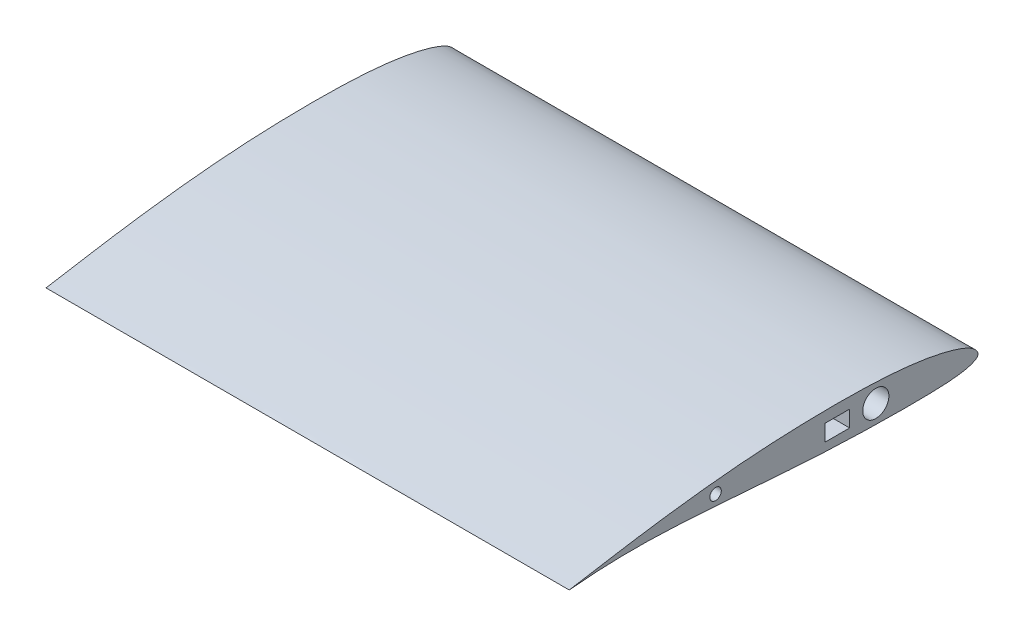
ISO-10303-21;
HEADER;
FILE_DESCRIPTION(('STEP AP214'),'2;1');
FILE_NAME('part.step','',(''),(''),'','','');
FILE_SCHEMA(('AUTOMOTIVE_DESIGN { 1 0 10303 214 1 1 1 1 }'));
ENDSEC;
DATA;
#1=APPLICATION_CONTEXT('core data for automotive mechanical design processes');
#2=APPLICATION_PROTOCOL_DEFINITION('international standard','automotive_design',2000,#1);
#3=PRODUCT_CONTEXT('',#1,'mechanical');
#4=PRODUCT('Part','Part','',(#3));
#5=PRODUCT_RELATED_PRODUCT_CATEGORY('part','',(#4));
#6=PRODUCT_DEFINITION_FORMATION('','',#4);
#7=PRODUCT_DEFINITION_CONTEXT('part definition',#1,'design');
#8=PRODUCT_DEFINITION('design','',#6,#7);
#9=PRODUCT_DEFINITION_SHAPE('','',#8);
#10=(LENGTH_UNIT() NAMED_UNIT(*) SI_UNIT(.MILLI.,.METRE.));
#11=(NAMED_UNIT(*) PLANE_ANGLE_UNIT() SI_UNIT($,.RADIAN.));
#12=(NAMED_UNIT(*) SI_UNIT($,.STERADIAN.) SOLID_ANGLE_UNIT());
#13=UNCERTAINTY_MEASURE_WITH_UNIT(LENGTH_MEASURE(1.E-05),#10,'distance_accuracy_value','');
#14=(GEOMETRIC_REPRESENTATION_CONTEXT(3) GLOBAL_UNCERTAINTY_ASSIGNED_CONTEXT((#13)) GLOBAL_UNIT_ASSIGNED_CONTEXT((#10,
#11,#12)) REPRESENTATION_CONTEXT('',''));
#15=CARTESIAN_POINT('',(0.,0.,0.));
#16=DIRECTION('',(0.,0.,1.));
#17=DIRECTION('',(1.,0.,0.));
#18=AXIS2_PLACEMENT_3D('',#15,#16,#17);
#19=CARTESIAN_POINT('',(320.,1.49711132773622,0.435092083404368));
#20=DIRECTION('',(-1.,0.,0.));
#21=DIRECTION('',(0.,0.,1.));
#22=AXIS2_PLACEMENT_3D('',#19,#20,#21);
#23=PLANE('',#22);
#24=CARTESIAN_POINT('',(320.,6.07732270373844,160.499919709394));
#25=DIRECTION('',(1.,0.,0.));
#26=DIRECTION('',(0.,0.,-1.));
#27=AXIS2_PLACEMENT_3D('',#24,#25,#26);
#28=CIRCLE('',#27,3.50000000000002);
#29=CARTESIAN_POINT('',(320.,6.07732270373844,156.999919709394));
#30=VERTEX_POINT('',#29);
#31=EDGE_CURVE('E148',#30,#30,#28,.T.);
#32=ORIENTED_EDGE('',*,*,#31,.F.);
#33=EDGE_LOOP('',(#32));
#34=FACE_BOUND('',#33,.T.);
#35=CARTESIAN_POINT('',(320.,5.07732270373844,62.4999197093942));
#36=DIRECTION('',(1.,0.,0.));
#37=DIRECTION('',(0.,0.,-1.));
#38=AXIS2_PLACEMENT_3D('',#35,#36,#37);
#39=CIRCLE('',#38,8.);
#40=CARTESIAN_POINT('',(320.,5.07732270373844,54.4999197093942));
#41=VERTEX_POINT('',#40);
#42=EDGE_CURVE('E113',#41,#41,#39,.T.);
#43=ORIENTED_EDGE('',*,*,#42,.F.);
#44=EDGE_LOOP('',(#43));
#45=FACE_BOUND('',#44,.T.);
#46=CARTESIAN_POINT('',(320.,0.,250.));
#47=CARTESIAN_POINT('',(320.,-0.0080427959719715,250.000228293678));
#48=CARTESIAN_POINT('',(320.,0.172375657967406,248.284955515532));
#49=CARTESIAN_POINT('',(320.,0.308690014795419,246.518112419387));
#50=CARTESIAN_POINT('',(320.,0.685693593852336,242.189387343398));
#51=CARTESIAN_POINT('',(320.,1.07410152891603,236.806461263496));
#52=CARTESIAN_POINT('',(320.,1.49731723995003,229.680385951639));
#53=CARTESIAN_POINT('',(320.,1.8232186026768,221.18415869828));
#54=CARTESIAN_POINT('',(320.,1.96762610068065,211.337618207726));
#55=CARTESIAN_POINT('',(320.,1.83322105638369,200.371188527109));
#56=CARTESIAN_POINT('',(320.,1.38960528984164,188.499913622482));
#57=CARTESIAN_POINT('',(320.,0.706014078000893,175.953687417433));
#58=CARTESIAN_POINT('',(320.,-0.160208641561513,162.931424917666));
#59=CARTESIAN_POINT('',(320.,-1.14801632724376,149.615771743617));
#60=CARTESIAN_POINT('',(320.,-2.19092490983926,136.176354994724));
#61=CARTESIAN_POINT('',(320.,-3.21958397917046,122.767140548026));
#62=CARTESIAN_POINT('',(320.,-4.15274312671142,109.520053587455));
#63=CARTESIAN_POINT('',(320.,-4.93856436487493,96.5460959745437));
#64=CARTESIAN_POINT('',(320.,-5.53683070268675,83.9408193016427));
#65=CARTESIAN_POINT('',(320.,-5.94764820461108,71.8018392906514));
#66=CARTESIAN_POINT('',(320.,-6.21845093878312,60.2452560030716));
#67=CARTESIAN_POINT('',(320.,-6.35536975583973,49.3987328907547));
#68=CARTESIAN_POINT('',(320.,-6.38138796281789,39.3972261942655));
#69=CARTESIAN_POINT('',(320.,-6.26504923032313,30.3619348419668));
#70=CARTESIAN_POINT('',(320.,-6.01216491688521,22.4121811031587));
#71=CARTESIAN_POINT('',(320.,-5.59743390072595,15.6262272306516));
#72=CARTESIAN_POINT('',(320.,-4.92870657935606,10.0719075109048));
#73=CARTESIAN_POINT('',(320.,-4.04044698146404,5.69769261214423));
#74=CARTESIAN_POINT('',(320.,-2.8657529844069,2.62532063874475));
#75=CARTESIAN_POINT('',(320.,-1.7115284699546,0.494884225045661));
#76=CARTESIAN_POINT('',(320.,-0.410454230626488,-0.0213125491030087));
#77=CARTESIAN_POINT('',(320.,0.792659826704065,0.0311691995850224));
#78=CARTESIAN_POINT('',(320.,2.30568433693192,0.812599241892923));
#79=CARTESIAN_POINT('',(320.,4.23835242447377,2.72886351673443));
#80=CARTESIAN_POINT('',(320.,6.11817212106947,5.76990724125498));
#81=CARTESIAN_POINT('',(320.,7.91359420170391,9.88094280419771));
#82=CARTESIAN_POINT('',(320.,9.64131817838287,15.0749304677094));
#83=CARTESIAN_POINT('',(320.,11.2838964878058,21.2987522216172));
#84=CARTESIAN_POINT('',(320.,12.7883817585812,28.4971721202648));
#85=CARTESIAN_POINT('',(320.,14.0978349081275,36.6073734062479));
#86=CARTESIAN_POINT('',(320.,15.1594290171638,45.573028440303));
#87=CARTESIAN_POINT('',(320.,15.9609039979753,55.3329100744701));
#88=CARTESIAN_POINT('',(320.,16.4940697383882,65.8165364983871));
#89=CARTESIAN_POINT('',(320.,16.7919897051422,76.9313762604552));
#90=CARTESIAN_POINT('',(320.,16.864754130909,88.5669490281142));
#91=CARTESIAN_POINT('',(320.,16.7267152914356,100.596999885542));
#92=CARTESIAN_POINT('',(320.,16.3833850637257,112.888825982424));
#93=CARTESIAN_POINT('',(320.,15.825573666627,125.31161581915));
#94=CARTESIAN_POINT('',(320.,15.0523318700684,137.743791097076));
#95=CARTESIAN_POINT('',(320.,14.0593390742259,150.072384382085));
#96=CARTESIAN_POINT('',(320.,12.8815869860292,162.191375055682));
#97=CARTESIAN_POINT('',(320.,11.5492803460744,173.989074322246));
#98=CARTESIAN_POINT('',(320.,10.1162497290333,185.35236444642));
#99=CARTESIAN_POINT('',(320.,8.63237912523508,196.163081697706));
#100=CARTESIAN_POINT('',(320.,7.13151388385034,206.300441402258));
#101=CARTESIAN_POINT('',(320.,5.73122176805054,215.560350587015));
#102=CARTESIAN_POINT('',(320.,4.29329512716244,223.97715704258));
#103=CARTESIAN_POINT('',(320.,3.1818088737293,231.363413336396));
#104=CARTESIAN_POINT('',(320.,2.09894241729889,237.746440904332));
#105=CARTESIAN_POINT('',(320.,1.2458619166603,242.622069365861));
#106=CARTESIAN_POINT('',(320.,0.552864946230777,246.64452933247));
#107=CARTESIAN_POINT('',(320.,0.246216764640028,248.328398440367));
#108=CARTESIAN_POINT('',(320.,0.00797737724443801,249.999773563223));
#109=CARTESIAN_POINT('',(320.,0.,250.));
#110=B_SPLINE_CURVE_WITH_KNOTS('',3,(#46,#47,#48,#49,#50,#51,#52,#53,#54,#55,#56,#57,#58,#59,
#60,#61,#62,#63,#64,#65,#66,#67,#68,#69,#70,#71,#72,#73,#74,#75,#76,#77,#78,#79,#80,#81,#82,#83,
#84,#85,#86,#87,#88,#89,#90,#91,#92,#93,#94,#95,#96,#97,#98,#99,#100,#101,#102,#103,#104,#105,
#106,#107,#108,#109),.UNSPECIFIED.,.T.,.F.,(4,1,1,1,1,1,1,1,1,1,1,1,1,1,1,1,1,1,1,1,1,1,1,1,1,1,
1,1,1,1,1,1,1,1,1,1,1,1,1,1,1,1,1,1,1,1,1,1,1,1,1,1,1,1,1,1,1,1,1,1,1,4),(0.,
0.00158888881614516,0.00632921783555629,0.0142024564897436,0.0251728077530557,
0.0391734833267743,0.0560606311759249,0.0755789238487882,0.0973636066296903,0.120926258366677,
0.145825281006277,0.171670911815127,0.198108536705041,0.22479018357162,0.25139057978404,
0.277643490654311,0.303326750051388,0.328257458029316,0.352272548115194,0.375156061746876,
0.396620664402003,0.416422729294005,0.434304420097656,0.450054679859308,0.463465465082325,
0.474478994238096,0.483169222153171,0.489678354497499,0.494104066315722,0.496910015324886,
0.497289784891853,0.501214273282496,0.506457950332762,0.51335695674223,0.522168631834455,
0.53296596992453,0.545689209241574,0.56022077890382,0.57643892310517,0.594258689005965,
0.613600244568652,0.634342385932902,0.656331109263004,0.679351893859712,0.703152302846811,
0.727478208080039,0.7520707394079,0.776691163534608,0.801140183976245,0.825214386971546,
0.848697423570622,0.871352857669295,0.892947448931157,0.913230871058069,0.931955467148994,
0.94834206907442,0.963693004275676,0.976235918239566,0.986320058750392,0.993788799349345,
0.998424034933867,1.),.UNSPECIFIED.);
#111=CARTESIAN_POINT('',(320.,0.,250.));
#112=VERTEX_POINT('',#111);
#113=EDGE_CURVE('E11',#112,#112,#110,.T.);
#114=ORIENTED_EDGE('',*,*,#113,.T.);
#115=EDGE_LOOP('',(#114));
#116=FACE_BOUND('',#115,.T.);
#117=DIRECTION('',(0.,1.,0.));
#118=VECTOR('',#117,1.);
#119=CARTESIAN_POINT('',(320.,10.0773227037384,78.4999197093942));
#120=LINE('',#119,#118);
#121=CARTESIAN_POINT('',(320.,0.0773227037384437,78.4999197093942));
#122=VERTEX_POINT('',#121);
#123=CARTESIAN_POINT('',(320.,10.0773227037384,78.4999197093942));
#124=VERTEX_POINT('',#123);
#125=EDGE_CURVE('E75',#122,#124,#120,.T.);
#126=ORIENTED_EDGE('',*,*,#125,.F.);
#127=DIRECTION('',(0.,0.,-1.));
#128=VECTOR('',#127,1.);
#129=CARTESIAN_POINT('',(320.,0.0773227037384437,78.4999197093942));
#130=LINE('',#129,#128);
#131=CARTESIAN_POINT('',(320.,0.0773227037384437,93.4999197093942));
#132=VERTEX_POINT('',#131);
#133=EDGE_CURVE('E97',#132,#122,#130,.T.);
#134=ORIENTED_EDGE('',*,*,#133,.F.);
#135=DIRECTION('',(0.,-1.,0.));
#136=VECTOR('',#135,1.);
#137=CARTESIAN_POINT('',(320.,10.0773227037384,93.4999197093942));
#138=LINE('',#137,#136);
#139=CARTESIAN_POINT('',(320.,10.0773227037384,93.4999197093942));
#140=VERTEX_POINT('',#139);
#141=EDGE_CURVE('E95',#140,#132,#138,.T.);
#142=ORIENTED_EDGE('',*,*,#141,.F.);
#143=DIRECTION('',(0.,0.,1.));
#144=VECTOR('',#143,1.);
#145=CARTESIAN_POINT('',(320.,10.0773227037384,78.4999197093942));
#146=LINE('',#145,#144);
#147=EDGE_CURVE('E83',#124,#140,#146,.T.);
#148=ORIENTED_EDGE('',*,*,#147,.F.);
#149=EDGE_LOOP('',(#126,#134,#142,#148));
#150=FACE_BOUND('',#149,.T.);
#151=ADVANCED_FACE('F32',(#34,#45,#116,#150),#23,.F.);
#152=CARTESIAN_POINT('',(0.,1.49711132773622,0.435092083404368));
#153=DIRECTION('',(-1.,0.,0.));
#154=DIRECTION('',(0.,0.,1.));
#155=AXIS2_PLACEMENT_3D('',#152,#153,#154);
#156=PLANE('',#155);
#157=CARTESIAN_POINT('',(0.,6.07732270373844,160.499919709394));
#158=DIRECTION('',(-1.,0.,0.));
#159=DIRECTION('',(0.,0.,1.));
#160=AXIS2_PLACEMENT_3D('',#157,#158,#159);
#161=CIRCLE('',#160,3.49999999999999);
#162=CARTESIAN_POINT('',(0.,6.07732270373844,163.999919709394));
#163=VERTEX_POINT('',#162);
#164=EDGE_CURVE('E160',#163,#163,#161,.T.);
#165=ORIENTED_EDGE('',*,*,#164,.F.);
#166=EDGE_LOOP('',(#165));
#167=FACE_BOUND('',#166,.T.);
#168=CARTESIAN_POINT('',(0.,0.,250.));
#169=CARTESIAN_POINT('',(0.,-0.0080427959719715,250.000228293678));
#170=CARTESIAN_POINT('',(0.,0.172375657967406,248.284955515532));
#171=CARTESIAN_POINT('',(0.,0.308690014795419,246.518112419387));
#172=CARTESIAN_POINT('',(0.,0.685693593852336,242.189387343398));
#173=CARTESIAN_POINT('',(0.,1.07410152891603,236.806461263496));
#174=CARTESIAN_POINT('',(0.,1.49731723995003,229.680385951639));
#175=CARTESIAN_POINT('',(0.,1.8232186026768,221.18415869828));
#176=CARTESIAN_POINT('',(0.,1.96762610068065,211.337618207726));
#177=CARTESIAN_POINT('',(0.,1.83322105638369,200.371188527109));
#178=CARTESIAN_POINT('',(0.,1.38960528984164,188.499913622482));
#179=CARTESIAN_POINT('',(0.,0.706014078000893,175.953687417433));
#180=CARTESIAN_POINT('',(0.,-0.160208641561513,162.931424917666));
#181=CARTESIAN_POINT('',(0.,-1.14801632724376,149.615771743617));
#182=CARTESIAN_POINT('',(0.,-2.19092490983926,136.176354994724));
#183=CARTESIAN_POINT('',(0.,-3.21958397917046,122.767140548026));
#184=CARTESIAN_POINT('',(0.,-4.15274312671142,109.520053587455));
#185=CARTESIAN_POINT('',(0.,-4.93856436487493,96.5460959745437));
#186=CARTESIAN_POINT('',(0.,-5.53683070268675,83.9408193016427));
#187=CARTESIAN_POINT('',(0.,-5.94764820461108,71.8018392906514));
#188=CARTESIAN_POINT('',(0.,-6.21845093878312,60.2452560030716));
#189=CARTESIAN_POINT('',(0.,-6.35536975583973,49.3987328907547));
#190=CARTESIAN_POINT('',(0.,-6.38138796281789,39.3972261942655));
#191=CARTESIAN_POINT('',(0.,-6.26504923032313,30.3619348419668));
#192=CARTESIAN_POINT('',(0.,-6.01216491688521,22.4121811031587));
#193=CARTESIAN_POINT('',(0.,-5.59743390072595,15.6262272306516));
#194=CARTESIAN_POINT('',(0.,-4.92870657935606,10.0719075109048));
#195=CARTESIAN_POINT('',(0.,-4.04044698146404,5.69769261214423));
#196=CARTESIAN_POINT('',(0.,-2.8657529844069,2.62532063874475));
#197=CARTESIAN_POINT('',(0.,-1.7115284699546,0.494884225045661));
#198=CARTESIAN_POINT('',(0.,-0.410454230626488,-0.0213125491030087));
#199=CARTESIAN_POINT('',(0.,0.792659826704065,0.0311691995850224));
#200=CARTESIAN_POINT('',(0.,2.30568433693192,0.812599241892923));
#201=CARTESIAN_POINT('',(0.,4.23835242447377,2.72886351673443));
#202=CARTESIAN_POINT('',(0.,6.11817212106947,5.76990724125498));
#203=CARTESIAN_POINT('',(0.,7.91359420170391,9.88094280419771));
#204=CARTESIAN_POINT('',(0.,9.64131817838287,15.0749304677094));
#205=CARTESIAN_POINT('',(0.,11.2838964878058,21.2987522216172));
#206=CARTESIAN_POINT('',(0.,12.7883817585812,28.4971721202648));
#207=CARTESIAN_POINT('',(0.,14.0978349081275,36.6073734062479));
#208=CARTESIAN_POINT('',(0.,15.1594290171638,45.573028440303));
#209=CARTESIAN_POINT('',(0.,15.9609039979753,55.3329100744701));
#210=CARTESIAN_POINT('',(0.,16.4940697383882,65.8165364983871));
#211=CARTESIAN_POINT('',(0.,16.7919897051422,76.9313762604552));
#212=CARTESIAN_POINT('',(0.,16.864754130909,88.5669490281142));
#213=CARTESIAN_POINT('',(0.,16.7267152914356,100.596999885542));
#214=CARTESIAN_POINT('',(0.,16.3833850637257,112.888825982424));
#215=CARTESIAN_POINT('',(0.,15.825573666627,125.31161581915));
#216=CARTESIAN_POINT('',(0.,15.0523318700684,137.743791097076));
#217=CARTESIAN_POINT('',(0.,14.0593390742259,150.072384382085));
#218=CARTESIAN_POINT('',(0.,12.8815869860292,162.191375055682));
#219=CARTESIAN_POINT('',(0.,11.5492803460744,173.989074322246));
#220=CARTESIAN_POINT('',(0.,10.1162497290333,185.35236444642));
#221=CARTESIAN_POINT('',(0.,8.63237912523508,196.163081697706));
#222=CARTESIAN_POINT('',(0.,7.13151388385034,206.300441402258));
#223=CARTESIAN_POINT('',(0.,5.73122176805054,215.560350587015));
#224=CARTESIAN_POINT('',(0.,4.29329512716244,223.97715704258));
#225=CARTESIAN_POINT('',(0.,3.1818088737293,231.363413336396));
#226=CARTESIAN_POINT('',(0.,2.09894241729889,237.746440904332));
#227=CARTESIAN_POINT('',(0.,1.2458619166603,242.622069365861));
#228=CARTESIAN_POINT('',(0.,0.552864946230777,246.64452933247));
#229=CARTESIAN_POINT('',(0.,0.246216764640028,248.328398440367));
#230=CARTESIAN_POINT('',(0.,0.00797737724443801,249.999773563223));
#231=CARTESIAN_POINT('',(0.,0.,250.));
#232=B_SPLINE_CURVE_WITH_KNOTS('',3,(#168,#169,#170,#171,#172,#173,#174,#175,#176,#177,#178,
#179,#180,#181,#182,#183,#184,#185,#186,#187,#188,#189,#190,#191,#192,#193,#194,#195,#196,#197,
#198,#199,#200,#201,#202,#203,#204,#205,#206,#207,#208,#209,#210,#211,#212,#213,#214,#215,#216,
#217,#218,#219,#220,#221,#222,#223,#224,#225,#226,#227,#228,#229,#230,#231),.UNSPECIFIED.,.T.,
.F.,(4,1,1,1,1,1,1,1,1,1,1,1,1,1,1,1,1,1,1,1,1,1,1,1,1,1,1,1,1,1,1,1,1,1,1,1,1,1,1,1,1,1,1,1,1,
1,1,1,1,1,1,1,1,1,1,1,1,1,1,1,1,4),(0.,0.00158888881614516,0.00632921783555629,
0.0142024564897436,0.0251728077530557,0.0391734833267743,0.0560606311759249,0.0755789238487882,
0.0973636066296903,0.120926258366677,0.145825281006277,0.171670911815127,0.198108536705041,
0.22479018357162,0.25139057978404,0.277643490654311,0.303326750051388,0.328257458029316,
0.352272548115194,0.375156061746876,0.396620664402003,0.416422729294005,0.434304420097656,
0.450054679859308,0.463465465082325,0.474478994238096,0.483169222153171,0.489678354497499,
0.494104066315722,0.496910015324886,0.497289784891853,0.501214273282496,0.506457950332762,
0.51335695674223,0.522168631834455,0.53296596992453,0.545689209241574,0.56022077890382,
0.57643892310517,0.594258689005965,0.613600244568652,0.634342385932902,0.656331109263004,
0.679351893859712,0.703152302846811,0.727478208080039,0.7520707394079,0.776691163534608,
0.801140183976245,0.825214386971546,0.848697423570622,0.871352857669295,0.892947448931157,
0.913230871058069,0.931955467148994,0.94834206907442,0.963693004275676,0.976235918239566,
0.986320058750392,0.993788799349345,0.998424034933867,1.),.UNSPECIFIED.);
#233=CARTESIAN_POINT('',(0.,0.,250.));
#234=VERTEX_POINT('',#233);
#235=EDGE_CURVE('E37',#234,#234,#232,.T.);
#236=ORIENTED_EDGE('',*,*,#235,.F.);
#237=EDGE_LOOP('',(#236));
#238=FACE_BOUND('',#237,.T.);
#239=CARTESIAN_POINT('',(0.,5.07732270373844,62.4999197093942));
#240=DIRECTION('',(1.,0.,0.));
#241=DIRECTION('',(0.,0.,-1.));
#242=AXIS2_PLACEMENT_3D('',#239,#240,#241);
#243=CIRCLE('',#242,8.);
#244=CARTESIAN_POINT('',(0.,5.07732270373844,54.4999197093942));
#245=VERTEX_POINT('',#244);
#246=EDGE_CURVE('E91',#245,#245,#243,.T.);
#247=ORIENTED_EDGE('',*,*,#246,.T.);
#248=EDGE_LOOP('',(#247));
#249=FACE_BOUND('',#248,.T.);
#250=DIRECTION('',(0.,0.,-1.));
#251=VECTOR('',#250,1.);
#252=CARTESIAN_POINT('',(0.,0.0773227037384437,78.4999197093942));
#253=LINE('',#252,#251);
#254=CARTESIAN_POINT('',(0.,0.0773227037384437,93.4999197093942));
#255=VERTEX_POINT('',#254);
#256=CARTESIAN_POINT('',(0.,0.0773227037384437,78.4999197093942));
#257=VERTEX_POINT('',#256);
#258=EDGE_CURVE('E84',#255,#257,#253,.T.);
#259=ORIENTED_EDGE('',*,*,#258,.T.);
#260=DIRECTION('',(0.,1.,0.));
#261=VECTOR('',#260,1.);
#262=CARTESIAN_POINT('',(0.,10.0773227037384,78.4999197093942));
#263=LINE('',#262,#261);
#264=CARTESIAN_POINT('',(0.,10.0773227037384,78.4999197093942));
#265=VERTEX_POINT('',#264);
#266=EDGE_CURVE('E57',#257,#265,#263,.T.);
#267=ORIENTED_EDGE('',*,*,#266,.T.);
#268=DIRECTION('',(0.,0.,1.));
#269=VECTOR('',#268,1.);
#270=CARTESIAN_POINT('',(0.,10.0773227037384,78.4999197093942));
#271=LINE('',#270,#269);
#272=CARTESIAN_POINT('',(0.,10.0773227037384,93.4999197093942));
#273=VERTEX_POINT('',#272);
#274=EDGE_CURVE('E90',#265,#273,#271,.T.);
#275=ORIENTED_EDGE('',*,*,#274,.T.);
#276=DIRECTION('',(0.,-1.,0.));
#277=VECTOR('',#276,1.);
#278=CARTESIAN_POINT('',(0.,10.0773227037384,93.4999197093942));
#279=LINE('',#278,#277);
#280=EDGE_CURVE('E105',#273,#255,#279,.T.);
#281=ORIENTED_EDGE('',*,*,#280,.T.);
#282=EDGE_LOOP('',(#259,#267,#275,#281));
#283=FACE_BOUND('',#282,.T.);
#284=ADVANCED_FACE('F125',(#167,#238,#249,#283),#156,.T.);
#285=DIRECTION('',(-1.,0.,0.));
#286=VECTOR('',#285,1.);
#287=SURFACE_OF_LINEAR_EXTRUSION('',#110,#286);
#288=ORIENTED_EDGE('',*,*,#113,.F.);
#289=EDGE_LOOP('',(#288));
#290=FACE_BOUND('',#289,.T.);
#291=ORIENTED_EDGE('',*,*,#235,.T.);
#292=EDGE_LOOP('',(#291));
#293=FACE_BOUND('',#292,.T.);
#294=ADVANCED_FACE('F34',(#290,#293),#287,.F.);
#295=CARTESIAN_POINT('',(320.,5.07732270373844,62.4999197093942));
#296=DIRECTION('',(-1.,0.,0.));
#297=DIRECTION('',(0.,0.,1.));
#298=AXIS2_PLACEMENT_3D('',#295,#296,#297);
#299=CYLINDRICAL_SURFACE('',#298,8.);
#300=ORIENTED_EDGE('',*,*,#42,.T.);
#301=EDGE_LOOP('',(#300));
#302=FACE_BOUND('',#301,.T.);
#303=ORIENTED_EDGE('',*,*,#246,.F.);
#304=EDGE_LOOP('',(#303));
#305=FACE_BOUND('',#304,.T.);
#306=ADVANCED_FACE('F128',(#302,#305),#299,.F.);
#307=CARTESIAN_POINT('',(320.,10.0773227037384,78.4999197093942));
#308=DIRECTION('',(0.,0.,1.));
#309=DIRECTION('',(1.,0.,0.));
#310=AXIS2_PLACEMENT_3D('',#307,#308,#309);
#311=PLANE('',#310);
#312=ORIENTED_EDGE('',*,*,#266,.F.);
#313=DIRECTION('',(-1.,0.,0.));
#314=VECTOR('',#313,1.);
#315=CARTESIAN_POINT('',(320.,0.0773227037384437,78.4999197093942));
#316=LINE('',#315,#314);
#317=EDGE_CURVE('E79',#122,#257,#316,.T.);
#318=ORIENTED_EDGE('',*,*,#317,.F.);
#319=ORIENTED_EDGE('',*,*,#125,.T.);
#320=DIRECTION('',(-1.,0.,0.));
#321=VECTOR('',#320,1.);
#322=CARTESIAN_POINT('',(320.,10.0773227037384,78.4999197093942));
#323=LINE('',#322,#321);
#324=EDGE_CURVE('E78',#124,#265,#323,.T.);
#325=ORIENTED_EDGE('',*,*,#324,.T.);
#326=EDGE_LOOP('',(#312,#318,#319,#325));
#327=FACE_BOUND('',#326,.T.);
#328=ADVANCED_FACE('F77',(#327),#311,.T.);
#329=CARTESIAN_POINT('',(320.,10.0773227037384,78.4999197093942));
#330=DIRECTION('',(0.,-1.,0.));
#331=DIRECTION('',(0.,0.,-1.));
#332=AXIS2_PLACEMENT_3D('',#329,#330,#331);
#333=PLANE('',#332);
#334=ORIENTED_EDGE('',*,*,#274,.F.);
#335=ORIENTED_EDGE('',*,*,#324,.F.);
#336=ORIENTED_EDGE('',*,*,#147,.T.);
#337=DIRECTION('',(-1.,0.,0.));
#338=VECTOR('',#337,1.);
#339=CARTESIAN_POINT('',(320.,10.0773227037384,93.4999197093942));
#340=LINE('',#339,#338);
#341=EDGE_CURVE('E92',#140,#273,#340,.T.);
#342=ORIENTED_EDGE('',*,*,#341,.T.);
#343=EDGE_LOOP('',(#334,#335,#336,#342));
#344=FACE_BOUND('',#343,.T.);
#345=ADVANCED_FACE('F87',(#344),#333,.T.);
#346=CARTESIAN_POINT('',(320.,10.0773227037384,93.4999197093942));
#347=DIRECTION('',(0.,0.,-1.));
#348=DIRECTION('',(-1.,0.,0.));
#349=AXIS2_PLACEMENT_3D('',#346,#347,#348);
#350=PLANE('',#349);
#351=ORIENTED_EDGE('',*,*,#280,.F.);
#352=ORIENTED_EDGE('',*,*,#341,.F.);
#353=ORIENTED_EDGE('',*,*,#141,.T.);
#354=DIRECTION('',(-1.,0.,0.));
#355=VECTOR('',#354,1.);
#356=CARTESIAN_POINT('',(320.,0.0773227037384437,93.4999197093942));
#357=LINE('',#356,#355);
#358=EDGE_CURVE('E49',#132,#255,#357,.T.);
#359=ORIENTED_EDGE('',*,*,#358,.T.);
#360=EDGE_LOOP('',(#351,#352,#353,#359));
#361=FACE_BOUND('',#360,.T.);
#362=ADVANCED_FACE('F180',(#361),#350,.T.);
#363=CARTESIAN_POINT('',(320.,0.0773227037384437,78.4999197093942));
#364=DIRECTION('',(0.,1.,0.));
#365=DIRECTION('',(0.,0.,1.));
#366=AXIS2_PLACEMENT_3D('',#363,#364,#365);
#367=PLANE('',#366);
#368=ORIENTED_EDGE('',*,*,#258,.F.);
#369=ORIENTED_EDGE('',*,*,#358,.F.);
#370=ORIENTED_EDGE('',*,*,#133,.T.);
#371=ORIENTED_EDGE('',*,*,#317,.T.);
#372=EDGE_LOOP('',(#368,#369,#370,#371));
#373=FACE_BOUND('',#372,.T.);
#374=ADVANCED_FACE('F170',(#373),#367,.T.);
#375=CARTESIAN_POINT('',(15.,6.07732270373844,160.499919709394));
#376=DIRECTION('',(-1.,0.,0.));
#377=DIRECTION('',(0.,0.,1.));
#378=AXIS2_PLACEMENT_3D('',#375,#376,#377);
#379=CYLINDRICAL_SURFACE('',#378,3.49999999999999);
#380=CARTESIAN_POINT('',(15.,6.07732270373844,160.499919709394));
#381=DIRECTION('',(-1.,0.,0.));
#382=DIRECTION('',(0.,0.,1.));
#383=AXIS2_PLACEMENT_3D('',#380,#381,#382);
#384=CIRCLE('',#383,3.49999999999999);
#385=CARTESIAN_POINT('',(15.,6.07732270373844,163.999919709394));
#386=VERTEX_POINT('',#385);
#387=EDGE_CURVE('E103',#386,#386,#384,.T.);
#388=ORIENTED_EDGE('',*,*,#387,.F.);
#389=EDGE_LOOP('',(#388));
#390=FACE_BOUND('',#389,.T.);
#391=ORIENTED_EDGE('',*,*,#164,.T.);
#392=EDGE_LOOP('',(#391));
#393=FACE_BOUND('',#392,.T.);
#394=ADVANCED_FACE('F167',(#390,#393),#379,.F.);
#395=CARTESIAN_POINT('',(15.,6.07732270373844,160.499919709394));
#396=DIRECTION('',(-1.,0.,0.));
#397=DIRECTION('',(0.,0.,1.));
#398=AXIS2_PLACEMENT_3D('',#395,#396,#397);
#399=PLANE('',#398);
#400=ORIENTED_EDGE('',*,*,#387,.T.);
#401=EDGE_LOOP('',(#400));
#402=FACE_BOUND('',#401,.T.);
#403=ADVANCED_FACE('F169',(#402),#399,.T.);
#404=CARTESIAN_POINT('',(305.,6.07732270373844,160.499919709394));
#405=DIRECTION('',(1.,0.,0.));
#406=DIRECTION('',(0.,0.,-1.));
#407=AXIS2_PLACEMENT_3D('',#404,#405,#406);
#408=CYLINDRICAL_SURFACE('',#407,3.50000000000002);
#409=CARTESIAN_POINT('',(305.,6.07732270373844,160.499919709394));
#410=DIRECTION('',(1.,0.,0.));
#411=DIRECTION('',(0.,0.,-1.));
#412=AXIS2_PLACEMENT_3D('',#409,#410,#411);
#413=CIRCLE('',#412,3.50000000000002);
#414=CARTESIAN_POINT('',(305.,6.07732270373844,156.999919709394));
#415=VERTEX_POINT('',#414);
#416=EDGE_CURVE('E157',#415,#415,#413,.T.);
#417=ORIENTED_EDGE('',*,*,#416,.F.);
#418=EDGE_LOOP('',(#417));
#419=FACE_BOUND('',#418,.T.);
#420=ORIENTED_EDGE('',*,*,#31,.T.);
#421=EDGE_LOOP('',(#420));
#422=FACE_BOUND('',#421,.T.);
#423=ADVANCED_FACE('F177',(#419,#422),#408,.F.);
#424=CARTESIAN_POINT('',(305.,6.07732270373844,160.499919709394));
#425=DIRECTION('',(1.,0.,0.));
#426=DIRECTION('',(0.,0.,-1.));
#427=AXIS2_PLACEMENT_3D('',#424,#425,#426);
#428=PLANE('',#427);
#429=ORIENTED_EDGE('',*,*,#416,.T.);
#430=EDGE_LOOP('',(#429));
#431=FACE_BOUND('',#430,.T.);
#432=ADVANCED_FACE('F231',(#431),#428,.T.);
#433=CLOSED_SHELL('',(#151,#284,#294,#306,#328,#345,#362,#374,#394,#403,#423,#432));
#434=MANIFOLD_SOLID_BREP('B2',#433);
#435=ADVANCED_BREP_SHAPE_REPRESENTATION('',(#18,#434),#14);
#436=SHAPE_DEFINITION_REPRESENTATION(#9,#435);
ENDSEC;
END-ISO-10303-21;
